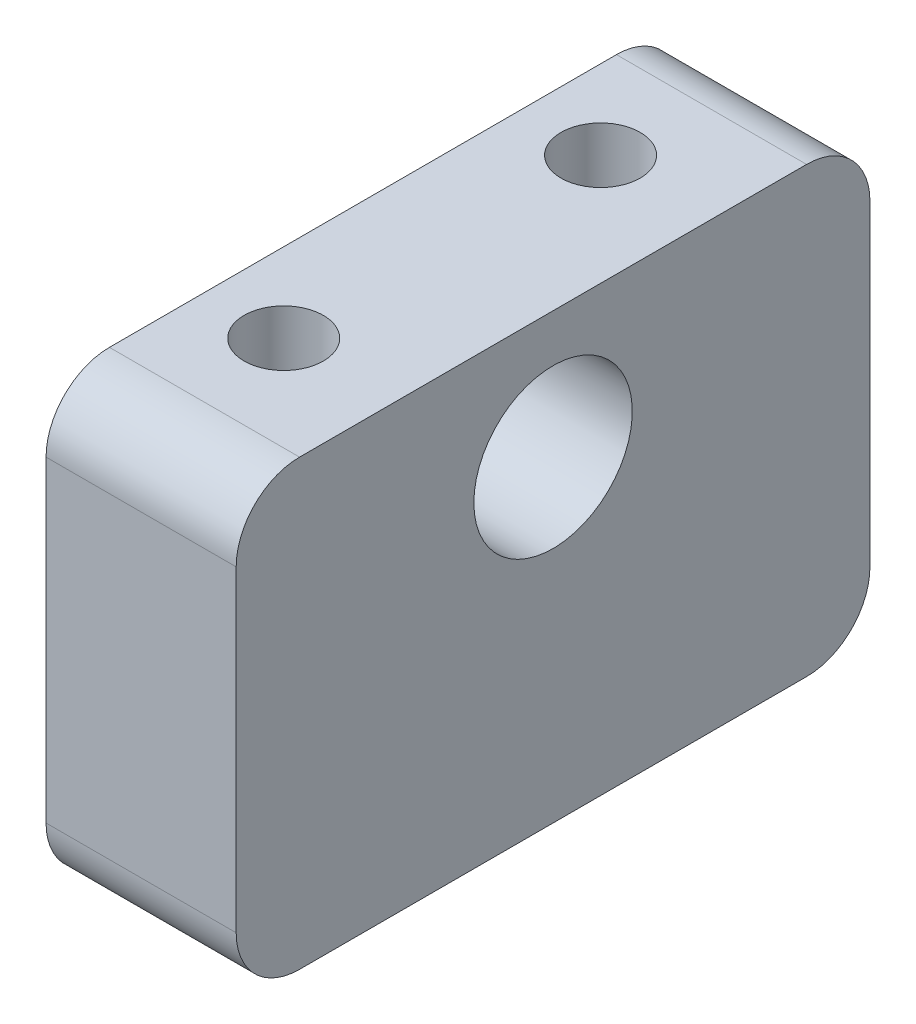
ISO-10303-21;
HEADER;
FILE_DESCRIPTION(('STEP AP214'),'2;1');
FILE_NAME('part.step','',(''),(''),'','','');
FILE_SCHEMA(('AUTOMOTIVE_DESIGN { 1 0 10303 214 1 1 1 1 }'));
ENDSEC;
DATA;
#1=APPLICATION_CONTEXT('core data for automotive mechanical design processes');
#2=APPLICATION_PROTOCOL_DEFINITION('international standard','automotive_design',2000,#1);
#3=PRODUCT_CONTEXT('',#1,'mechanical');
#4=PRODUCT('Part','Part','',(#3));
#5=PRODUCT_RELATED_PRODUCT_CATEGORY('part','',(#4));
#6=PRODUCT_DEFINITION_FORMATION('','',#4);
#7=PRODUCT_DEFINITION_CONTEXT('part definition',#1,'design');
#8=PRODUCT_DEFINITION('design','',#6,#7);
#9=PRODUCT_DEFINITION_SHAPE('','',#8);
#10=(LENGTH_UNIT() NAMED_UNIT(*) SI_UNIT(.MILLI.,.METRE.));
#11=(NAMED_UNIT(*) PLANE_ANGLE_UNIT() SI_UNIT($,.RADIAN.));
#12=(NAMED_UNIT(*) SI_UNIT($,.STERADIAN.) SOLID_ANGLE_UNIT());
#13=UNCERTAINTY_MEASURE_WITH_UNIT(LENGTH_MEASURE(1.E-05),#10,'distance_accuracy_value','');
#14=(GEOMETRIC_REPRESENTATION_CONTEXT(3) GLOBAL_UNCERTAINTY_ASSIGNED_CONTEXT((#13)) GLOBAL_UNIT_ASSIGNED_CONTEXT((#10,
#11,#12)) REPRESENTATION_CONTEXT('',''));
#15=CARTESIAN_POINT('',(0.,0.,0.));
#16=DIRECTION('',(0.,0.,1.));
#17=DIRECTION('',(1.,0.,0.));
#18=AXIS2_PLACEMENT_3D('',#15,#16,#17);
#19=CARTESIAN_POINT('',(3.,14.,10.));
#20=DIRECTION('',(-1.,0.,0.));
#21=DIRECTION('',(0.,0.,1.));
#22=AXIS2_PLACEMENT_3D('',#19,#20,#21);
#23=PLANE('',#22);
#24=CARTESIAN_POINT('',(3.,10.,0.));
#25=DIRECTION('',(-1.,0.,0.));
#26=DIRECTION('',(0.,0.,1.));
#27=AXIS2_PLACEMENT_3D('',#24,#25,#26);
#28=CIRCLE('',#27,2.5);
#29=CARTESIAN_POINT('',(3.,10.,2.5));
#30=VERTEX_POINT('',#29);
#31=EDGE_CURVE('E231',#30,#30,#28,.T.);
#32=ORIENTED_EDGE('',*,*,#31,.T.);
#33=EDGE_LOOP('',(#32));
#34=FACE_BOUND('',#33,.T.);
#35=DIRECTION('',(0.,-1.,0.));
#36=VECTOR('',#35,1.);
#37=CARTESIAN_POINT('',(3.,14.,10.));
#38=LINE('',#37,#36);
#39=CARTESIAN_POINT('',(3.,12.,10.));
#40=VERTEX_POINT('',#39);
#41=CARTESIAN_POINT('',(3.,2.,10.));
#42=VERTEX_POINT('',#41);
#43=EDGE_CURVE('E105',#40,#42,#38,.T.);
#44=ORIENTED_EDGE('',*,*,#43,.T.);
#45=CARTESIAN_POINT('',(3.,2.,8.));
#46=DIRECTION('',(-1.,0.,0.));
#47=DIRECTION('',(0.,0.,1.));
#48=AXIS2_PLACEMENT_3D('',#45,#46,#47);
#49=CIRCLE('',#48,2.);
#50=CARTESIAN_POINT('',(3.,0.,8.));
#51=VERTEX_POINT('',#50);
#52=EDGE_CURVE('E138',#42,#51,#49,.F.);
#53=ORIENTED_EDGE('',*,*,#52,.T.);
#54=DIRECTION('',(0.,0.,-1.));
#55=VECTOR('',#54,1.);
#56=CARTESIAN_POINT('',(3.,0.,10.));
#57=LINE('',#56,#55);
#58=CARTESIAN_POINT('',(3.,0.,-8.));
#59=VERTEX_POINT('',#58);
#60=EDGE_CURVE('E166',#51,#59,#57,.T.);
#61=ORIENTED_EDGE('',*,*,#60,.T.);
#62=CARTESIAN_POINT('',(3.,2.,-8.));
#63=DIRECTION('',(-1.,0.,0.));
#64=DIRECTION('',(0.,0.,1.));
#65=AXIS2_PLACEMENT_3D('',#62,#63,#64);
#66=CIRCLE('',#65,2.);
#67=CARTESIAN_POINT('',(3.,2.,-10.));
#68=VERTEX_POINT('',#67);
#69=EDGE_CURVE('E111',#59,#68,#66,.F.);
#70=ORIENTED_EDGE('',*,*,#69,.T.);
#71=DIRECTION('',(0.,-1.,0.));
#72=VECTOR('',#71,1.);
#73=CARTESIAN_POINT('',(3.,14.,-10.));
#74=LINE('',#73,#72);
#75=CARTESIAN_POINT('',(3.,12.,-10.));
#76=VERTEX_POINT('',#75);
#77=EDGE_CURVE('E128',#76,#68,#74,.T.);
#78=ORIENTED_EDGE('',*,*,#77,.F.);
#79=CARTESIAN_POINT('',(3.,12.,-8.));
#80=DIRECTION('',(-1.,0.,0.));
#81=DIRECTION('',(0.,0.,1.));
#82=AXIS2_PLACEMENT_3D('',#79,#80,#81);
#83=CIRCLE('',#82,2.);
#84=CARTESIAN_POINT('',(3.,14.,-8.));
#85=VERTEX_POINT('',#84);
#86=EDGE_CURVE('E112',#76,#85,#83,.F.);
#87=ORIENTED_EDGE('',*,*,#86,.T.);
#88=DIRECTION('',(0.,0.,-1.));
#89=VECTOR('',#88,1.);
#90=CARTESIAN_POINT('',(3.,14.,10.));
#91=LINE('',#90,#89);
#92=CARTESIAN_POINT('',(3.,14.,8.));
#93=VERTEX_POINT('',#92);
#94=EDGE_CURVE('E107',#93,#85,#91,.T.);
#95=ORIENTED_EDGE('',*,*,#94,.F.);
#96=CARTESIAN_POINT('',(3.,12.,8.));
#97=DIRECTION('',(-1.,0.,0.));
#98=DIRECTION('',(0.,0.,1.));
#99=AXIS2_PLACEMENT_3D('',#96,#97,#98);
#100=CIRCLE('',#99,2.);
#101=EDGE_CURVE('E103',#93,#40,#100,.F.);
#102=ORIENTED_EDGE('',*,*,#101,.T.);
#103=EDGE_LOOP('',(#44,#53,#61,#70,#78,#87,#95,#102));
#104=FACE_BOUND('',#103,.T.);
#105=ADVANCED_FACE('F36',(#34,#104),#23,.F.);
#106=CARTESIAN_POINT('',(-3.,14.,-10.));
#107=DIRECTION('',(0.,0.,1.));
#108=DIRECTION('',(1.,0.,0.));
#109=AXIS2_PLACEMENT_3D('',#106,#107,#108);
#110=PLANE('',#109);
#111=ORIENTED_EDGE('',*,*,#77,.T.);
#112=DIRECTION('',(-1.,0.,0.));
#113=VECTOR('',#112,1.);
#114=CARTESIAN_POINT('',(-3.,2.,-10.));
#115=LINE('',#114,#113);
#116=CARTESIAN_POINT('',(-3.,2.,-10.));
#117=VERTEX_POINT('',#116);
#118=EDGE_CURVE('E151',#68,#117,#115,.T.);
#119=ORIENTED_EDGE('',*,*,#118,.T.);
#120=DIRECTION('',(0.,-1.,0.));
#121=VECTOR('',#120,1.);
#122=CARTESIAN_POINT('',(-3.,14.,-10.));
#123=LINE('',#122,#121);
#124=CARTESIAN_POINT('',(-3.,12.,-10.));
#125=VERTEX_POINT('',#124);
#126=EDGE_CURVE('E132',#125,#117,#123,.T.);
#127=ORIENTED_EDGE('',*,*,#126,.F.);
#128=DIRECTION('',(-1.,0.,0.));
#129=VECTOR('',#128,1.);
#130=CARTESIAN_POINT('',(-3.,12.,-10.));
#131=LINE('',#130,#129);
#132=EDGE_CURVE('E149',#125,#76,#131,.F.);
#133=ORIENTED_EDGE('',*,*,#132,.T.);
#134=EDGE_LOOP('',(#111,#119,#127,#133));
#135=FACE_BOUND('',#134,.T.);
#136=ADVANCED_FACE('F174',(#135),#110,.F.);
#137=CARTESIAN_POINT('',(-3.,14.,10.));
#138=DIRECTION('',(1.,0.,0.));
#139=DIRECTION('',(0.,0.,-1.));
#140=AXIS2_PLACEMENT_3D('',#137,#138,#139);
#141=PLANE('',#140);
#142=CARTESIAN_POINT('',(-3.,10.,0.));
#143=DIRECTION('',(-1.,0.,0.));
#144=DIRECTION('',(0.,0.,1.));
#145=AXIS2_PLACEMENT_3D('',#142,#143,#144);
#146=CIRCLE('',#145,2.5);
#147=CARTESIAN_POINT('',(-3.,10.,2.5));
#148=VERTEX_POINT('',#147);
#149=EDGE_CURVE('E235',#148,#148,#146,.T.);
#150=ORIENTED_EDGE('',*,*,#149,.F.);
#151=EDGE_LOOP('',(#150));
#152=FACE_BOUND('',#151,.T.);
#153=DIRECTION('',(0.,0.,1.));
#154=VECTOR('',#153,1.);
#155=CARTESIAN_POINT('',(-3.,0.,10.));
#156=LINE('',#155,#154);
#157=CARTESIAN_POINT('',(-3.,0.,-8.));
#158=VERTEX_POINT('',#157);
#159=CARTESIAN_POINT('',(-3.,0.,8.));
#160=VERTEX_POINT('',#159);
#161=EDGE_CURVE('E162',#158,#160,#156,.T.);
#162=ORIENTED_EDGE('',*,*,#161,.T.);
#163=CARTESIAN_POINT('',(-3.,2.,8.));
#164=DIRECTION('',(1.,0.,0.));
#165=DIRECTION('',(0.,0.,-1.));
#166=AXIS2_PLACEMENT_3D('',#163,#164,#165);
#167=CIRCLE('',#166,2.);
#168=CARTESIAN_POINT('',(-3.,2.,10.));
#169=VERTEX_POINT('',#168);
#170=EDGE_CURVE('E147',#160,#169,#167,.F.);
#171=ORIENTED_EDGE('',*,*,#170,.T.);
#172=DIRECTION('',(0.,-1.,0.));
#173=VECTOR('',#172,1.);
#174=CARTESIAN_POINT('',(-3.,14.,10.));
#175=LINE('',#174,#173);
#176=CARTESIAN_POINT('',(-3.,12.,10.));
#177=VERTEX_POINT('',#176);
#178=EDGE_CURVE('E122',#177,#169,#175,.T.);
#179=ORIENTED_EDGE('',*,*,#178,.F.);
#180=CARTESIAN_POINT('',(-3.,12.,8.));
#181=DIRECTION('',(1.,0.,0.));
#182=DIRECTION('',(0.,0.,-1.));
#183=AXIS2_PLACEMENT_3D('',#180,#181,#182);
#184=CIRCLE('',#183,2.);
#185=CARTESIAN_POINT('',(-3.,14.,8.));
#186=VERTEX_POINT('',#185);
#187=EDGE_CURVE('E127',#177,#186,#184,.F.);
#188=ORIENTED_EDGE('',*,*,#187,.T.);
#189=DIRECTION('',(0.,0.,1.));
#190=VECTOR('',#189,1.);
#191=CARTESIAN_POINT('',(-3.,14.,10.));
#192=LINE('',#191,#190);
#193=CARTESIAN_POINT('',(-3.,14.,-8.));
#194=VERTEX_POINT('',#193);
#195=EDGE_CURVE('E123',#194,#186,#192,.T.);
#196=ORIENTED_EDGE('',*,*,#195,.F.);
#197=CARTESIAN_POINT('',(-3.,12.,-8.));
#198=DIRECTION('',(1.,0.,0.));
#199=DIRECTION('',(0.,0.,-1.));
#200=AXIS2_PLACEMENT_3D('',#197,#198,#199);
#201=CIRCLE('',#200,2.);
#202=EDGE_CURVE('E59',#194,#125,#201,.F.);
#203=ORIENTED_EDGE('',*,*,#202,.T.);
#204=ORIENTED_EDGE('',*,*,#126,.T.);
#205=CARTESIAN_POINT('',(-3.,2.,-8.));
#206=DIRECTION('',(1.,0.,0.));
#207=DIRECTION('',(0.,0.,-1.));
#208=AXIS2_PLACEMENT_3D('',#205,#206,#207);
#209=CIRCLE('',#208,2.);
#210=EDGE_CURVE('E51',#117,#158,#209,.F.);
#211=ORIENTED_EDGE('',*,*,#210,.T.);
#212=EDGE_LOOP('',(#162,#171,#179,#188,#196,#203,#204,#211));
#213=FACE_BOUND('',#212,.T.);
#214=ADVANCED_FACE('F160',(#152,#213),#141,.F.);
#215=CARTESIAN_POINT('',(-3.,14.,10.));
#216=DIRECTION('',(0.,0.,-1.));
#217=DIRECTION('',(-1.,0.,0.));
#218=AXIS2_PLACEMENT_3D('',#215,#216,#217);
#219=PLANE('',#218);
#220=ORIENTED_EDGE('',*,*,#178,.T.);
#221=DIRECTION('',(1.,0.,0.));
#222=VECTOR('',#221,1.);
#223=CARTESIAN_POINT('',(3.,2.,10.));
#224=LINE('',#223,#222);
#225=EDGE_CURVE('E121',#169,#42,#224,.T.);
#226=ORIENTED_EDGE('',*,*,#225,.T.);
#227=ORIENTED_EDGE('',*,*,#43,.F.);
#228=DIRECTION('',(1.,0.,0.));
#229=VECTOR('',#228,1.);
#230=CARTESIAN_POINT('',(-3.,12.,10.));
#231=LINE('',#230,#229);
#232=EDGE_CURVE('E118',#40,#177,#231,.F.);
#233=ORIENTED_EDGE('',*,*,#232,.T.);
#234=EDGE_LOOP('',(#220,#226,#227,#233));
#235=FACE_BOUND('',#234,.T.);
#236=ADVANCED_FACE('F117',(#235),#219,.F.);
#237=CARTESIAN_POINT('',(0.,14.,0.));
#238=DIRECTION('',(0.,-1.,0.));
#239=DIRECTION('',(0.,0.,-1.));
#240=AXIS2_PLACEMENT_3D('',#237,#238,#239);
#241=PLANE('',#240);
#242=CARTESIAN_POINT('',(-0.5,14.,-5.));
#243=DIRECTION('',(0.,1.,0.));
#244=DIRECTION('',(0.,0.,1.));
#245=AXIS2_PLACEMENT_3D('',#242,#243,#244);
#246=CIRCLE('',#245,1.25);
#247=CARTESIAN_POINT('',(-0.5,14.,-3.75));
#248=VERTEX_POINT('',#247);
#249=EDGE_CURVE('E230',#248,#248,#246,.T.);
#250=ORIENTED_EDGE('',*,*,#249,.F.);
#251=EDGE_LOOP('',(#250));
#252=FACE_BOUND('',#251,.T.);
#253=CARTESIAN_POINT('',(-0.5,14.,5.));
#254=DIRECTION('',(0.,1.,0.));
#255=DIRECTION('',(0.,0.,1.));
#256=AXIS2_PLACEMENT_3D('',#253,#254,#255);
#257=CIRCLE('',#256,1.25);
#258=CARTESIAN_POINT('',(-0.5,14.,6.25));
#259=VERTEX_POINT('',#258);
#260=EDGE_CURVE('E233',#259,#259,#257,.T.);
#261=ORIENTED_EDGE('',*,*,#260,.F.);
#262=EDGE_LOOP('',(#261));
#263=FACE_BOUND('',#262,.T.);
#264=ORIENTED_EDGE('',*,*,#195,.T.);
#265=DIRECTION('',(1.,0.,0.));
#266=VECTOR('',#265,1.);
#267=CARTESIAN_POINT('',(0.,14.,8.));
#268=LINE('',#267,#266);
#269=EDGE_CURVE('E11',#186,#93,#268,.T.);
#270=ORIENTED_EDGE('',*,*,#269,.T.);
#271=ORIENTED_EDGE('',*,*,#94,.T.);
#272=DIRECTION('',(-1.,0.,0.));
#273=VECTOR('',#272,1.);
#274=CARTESIAN_POINT('',(0.,14.,-8.));
#275=LINE('',#274,#273);
#276=EDGE_CURVE('E44',#85,#194,#275,.T.);
#277=ORIENTED_EDGE('',*,*,#276,.T.);
#278=EDGE_LOOP('',(#264,#270,#271,#277));
#279=FACE_BOUND('',#278,.T.);
#280=ADVANCED_FACE('F156',(#252,#263,#279),#241,.F.);
#281=CARTESIAN_POINT('',(0.,0.,0.));
#282=DIRECTION('',(0.,-1.,0.));
#283=DIRECTION('',(0.,0.,-1.));
#284=AXIS2_PLACEMENT_3D('',#281,#282,#283);
#285=PLANE('',#284);
#286=CARTESIAN_POINT('',(-0.5,0.,-5.));
#287=DIRECTION('',(0.,1.,0.));
#288=DIRECTION('',(0.,0.,1.));
#289=AXIS2_PLACEMENT_3D('',#286,#287,#288);
#290=CIRCLE('',#289,1.25);
#291=CARTESIAN_POINT('',(-0.5,0.,-3.75));
#292=VERTEX_POINT('',#291);
#293=EDGE_CURVE('E227',#292,#292,#290,.T.);
#294=ORIENTED_EDGE('',*,*,#293,.T.);
#295=EDGE_LOOP('',(#294));
#296=FACE_BOUND('',#295,.T.);
#297=CARTESIAN_POINT('',(-0.5,0.,5.));
#298=DIRECTION('',(0.,1.,0.));
#299=DIRECTION('',(0.,0.,1.));
#300=AXIS2_PLACEMENT_3D('',#297,#298,#299);
#301=CIRCLE('',#300,1.25);
#302=CARTESIAN_POINT('',(-0.5,0.,6.25));
#303=VERTEX_POINT('',#302);
#304=EDGE_CURVE('E169',#303,#303,#301,.T.);
#305=ORIENTED_EDGE('',*,*,#304,.T.);
#306=EDGE_LOOP('',(#305));
#307=FACE_BOUND('',#306,.T.);
#308=ORIENTED_EDGE('',*,*,#60,.F.);
#309=DIRECTION('',(1.,0.,0.));
#310=VECTOR('',#309,1.);
#311=CARTESIAN_POINT('',(-3.,0.,8.));
#312=LINE('',#311,#310);
#313=EDGE_CURVE('E142',#51,#160,#312,.F.);
#314=ORIENTED_EDGE('',*,*,#313,.T.);
#315=ORIENTED_EDGE('',*,*,#161,.F.);
#316=DIRECTION('',(-1.,0.,0.));
#317=VECTOR('',#316,1.);
#318=CARTESIAN_POINT('',(3.,0.,-8.));
#319=LINE('',#318,#317);
#320=EDGE_CURVE('E140',#158,#59,#319,.F.);
#321=ORIENTED_EDGE('',*,*,#320,.T.);
#322=EDGE_LOOP('',(#308,#314,#315,#321));
#323=FACE_BOUND('',#322,.T.);
#324=ADVANCED_FACE('F180',(#296,#307,#323),#285,.T.);
#325=CARTESIAN_POINT('',(-0.5,0.,5.));
#326=DIRECTION('',(0.,1.,0.));
#327=DIRECTION('',(0.,0.,1.));
#328=AXIS2_PLACEMENT_3D('',#325,#326,#327);
#329=CYLINDRICAL_SURFACE('',#328,1.25);
#330=ORIENTED_EDGE('',*,*,#304,.F.);
#331=EDGE_LOOP('',(#330));
#332=FACE_BOUND('',#331,.T.);
#333=ORIENTED_EDGE('',*,*,#260,.T.);
#334=EDGE_LOOP('',(#333));
#335=FACE_BOUND('',#334,.T.);
#336=ADVANCED_FACE('F212',(#332,#335),#329,.F.);
#337=CARTESIAN_POINT('',(-0.5,0.,-5.));
#338=DIRECTION('',(0.,1.,0.));
#339=DIRECTION('',(0.,0.,1.));
#340=AXIS2_PLACEMENT_3D('',#337,#338,#339);
#341=CYLINDRICAL_SURFACE('',#340,1.25);
#342=ORIENTED_EDGE('',*,*,#293,.F.);
#343=EDGE_LOOP('',(#342));
#344=FACE_BOUND('',#343,.T.);
#345=ORIENTED_EDGE('',*,*,#249,.T.);
#346=EDGE_LOOP('',(#345));
#347=FACE_BOUND('',#346,.T.);
#348=ADVANCED_FACE('F193',(#344,#347),#341,.F.);
#349=CARTESIAN_POINT('',(11.,10.,0.));
#350=DIRECTION('',(-1.,0.,0.));
#351=DIRECTION('',(0.,0.,1.));
#352=AXIS2_PLACEMENT_3D('',#349,#350,#351);
#353=CYLINDRICAL_SURFACE('',#352,2.5);
#354=ORIENTED_EDGE('',*,*,#149,.T.);
#355=EDGE_LOOP('',(#354));
#356=FACE_BOUND('',#355,.T.);
#357=ORIENTED_EDGE('',*,*,#31,.F.);
#358=EDGE_LOOP('',(#357));
#359=FACE_BOUND('',#358,.T.);
#360=ADVANCED_FACE('F186',(#356,#359),#353,.F.);
#361=CARTESIAN_POINT('',(-3.,2.,8.));
#362=DIRECTION('',(-1.,0.,0.));
#363=DIRECTION('',(0.,0.,1.));
#364=AXIS2_PLACEMENT_3D('',#361,#362,#363);
#365=CYLINDRICAL_SURFACE('',#364,2.);
#366=ORIENTED_EDGE('',*,*,#170,.F.);
#367=ORIENTED_EDGE('',*,*,#313,.F.);
#368=ORIENTED_EDGE('',*,*,#52,.F.);
#369=ORIENTED_EDGE('',*,*,#225,.F.);
#370=EDGE_LOOP('',(#366,#367,#368,#369));
#371=FACE_BOUND('',#370,.T.);
#372=ADVANCED_FACE('F184',(#371),#365,.T.);
#373=CARTESIAN_POINT('',(-3.,2.,-8.));
#374=DIRECTION('',(1.,0.,0.));
#375=DIRECTION('',(0.,0.,-1.));
#376=AXIS2_PLACEMENT_3D('',#373,#374,#375);
#377=CYLINDRICAL_SURFACE('',#376,2.);
#378=ORIENTED_EDGE('',*,*,#69,.F.);
#379=ORIENTED_EDGE('',*,*,#320,.F.);
#380=ORIENTED_EDGE('',*,*,#210,.F.);
#381=ORIENTED_EDGE('',*,*,#118,.F.);
#382=EDGE_LOOP('',(#378,#379,#380,#381));
#383=FACE_BOUND('',#382,.T.);
#384=ADVANCED_FACE('F177',(#383),#377,.T.);
#385=CARTESIAN_POINT('',(0.,12.,8.));
#386=DIRECTION('',(1.,0.,0.));
#387=DIRECTION('',(0.,0.,-1.));
#388=AXIS2_PLACEMENT_3D('',#385,#386,#387);
#389=CYLINDRICAL_SURFACE('',#388,2.);
#390=ORIENTED_EDGE('',*,*,#187,.F.);
#391=ORIENTED_EDGE('',*,*,#232,.F.);
#392=ORIENTED_EDGE('',*,*,#101,.F.);
#393=ORIENTED_EDGE('',*,*,#269,.F.);
#394=EDGE_LOOP('',(#390,#391,#392,#393));
#395=FACE_BOUND('',#394,.T.);
#396=ADVANCED_FACE('F126',(#395),#389,.T.);
#397=CARTESIAN_POINT('',(0.,12.,-8.));
#398=DIRECTION('',(-1.,0.,0.));
#399=DIRECTION('',(0.,0.,1.));
#400=AXIS2_PLACEMENT_3D('',#397,#398,#399);
#401=CYLINDRICAL_SURFACE('',#400,2.);
#402=ORIENTED_EDGE('',*,*,#86,.F.);
#403=ORIENTED_EDGE('',*,*,#132,.F.);
#404=ORIENTED_EDGE('',*,*,#202,.F.);
#405=ORIENTED_EDGE('',*,*,#276,.F.);
#406=EDGE_LOOP('',(#402,#403,#404,#405));
#407=FACE_BOUND('',#406,.T.);
#408=ADVANCED_FACE('F38',(#407),#401,.T.);
#409=CLOSED_SHELL('',(#105,#136,#214,#236,#280,#324,#336,#348,#360,#372,#384,#396,#408));
#410=MANIFOLD_SOLID_BREP('B2',#409);
#411=ADVANCED_BREP_SHAPE_REPRESENTATION('',(#18,#410),#14);
#412=SHAPE_DEFINITION_REPRESENTATION(#9,#411);
ENDSEC;
END-ISO-10303-21;
